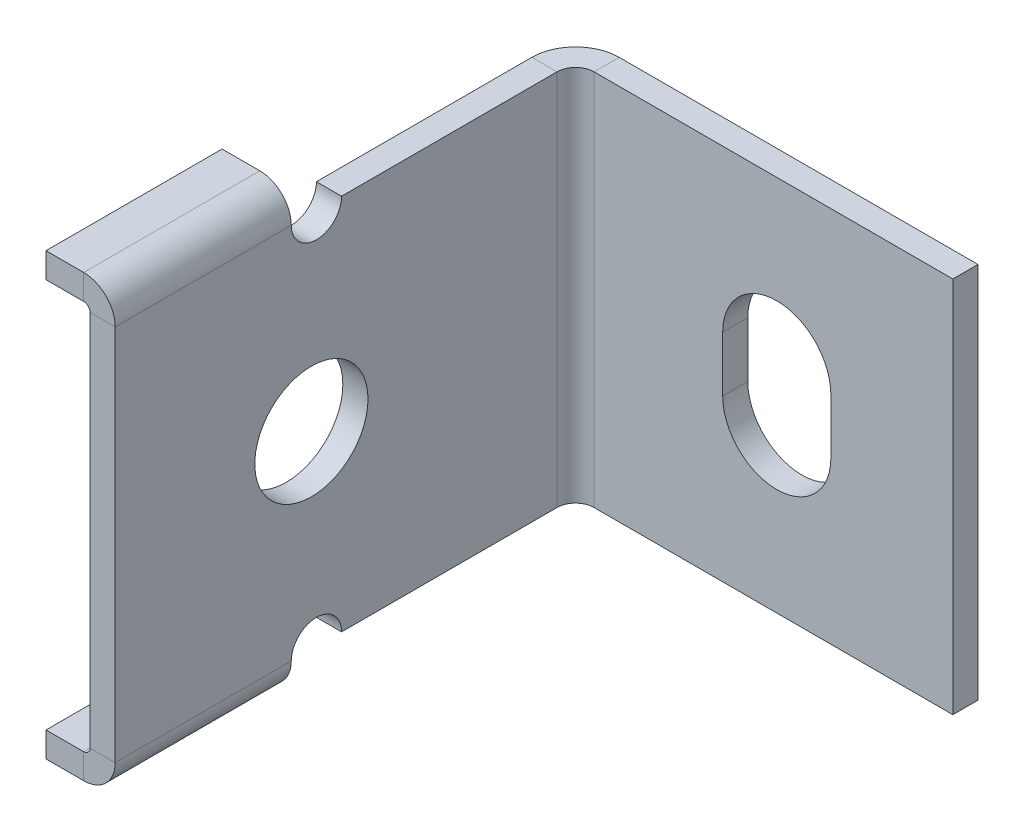
ISO-10303-21;
HEADER;
FILE_DESCRIPTION(('STEP AP214'),'2;1');
FILE_NAME('part.step','',(''),(''),'','','');
FILE_SCHEMA(('AUTOMOTIVE_DESIGN { 1 0 10303 214 1 1 1 1 }'));
ENDSEC;
DATA;
#1=APPLICATION_CONTEXT('core data for automotive mechanical design processes');
#2=APPLICATION_PROTOCOL_DEFINITION('international standard','automotive_design',2000,#1);
#3=PRODUCT_CONTEXT('',#1,'mechanical');
#4=PRODUCT('Part','Part','',(#3));
#5=PRODUCT_RELATED_PRODUCT_CATEGORY('part','',(#4));
#6=PRODUCT_DEFINITION_FORMATION('','',#4);
#7=PRODUCT_DEFINITION_CONTEXT('part definition',#1,'design');
#8=PRODUCT_DEFINITION('design','',#6,#7);
#9=PRODUCT_DEFINITION_SHAPE('','',#8);
#10=(LENGTH_UNIT() NAMED_UNIT(*) SI_UNIT(.MILLI.,.METRE.));
#11=(NAMED_UNIT(*) PLANE_ANGLE_UNIT() SI_UNIT($,.RADIAN.));
#12=(NAMED_UNIT(*) SI_UNIT($,.STERADIAN.) SOLID_ANGLE_UNIT());
#13=UNCERTAINTY_MEASURE_WITH_UNIT(LENGTH_MEASURE(1.E-05),#10,'distance_accuracy_value','');
#14=(GEOMETRIC_REPRESENTATION_CONTEXT(3) GLOBAL_UNCERTAINTY_ASSIGNED_CONTEXT((#13)) GLOBAL_UNIT_ASSIGNED_CONTEXT((#10,
#11,#12)) REPRESENTATION_CONTEXT('',''));
#15=CARTESIAN_POINT('',(0.,0.,0.));
#16=DIRECTION('',(0.,0.,1.));
#17=DIRECTION('',(1.,0.,0.));
#18=AXIS2_PLACEMENT_3D('',#15,#16,#17);
#19=CARTESIAN_POINT('',(1.7366,7.5,1.7366));
#20=DIRECTION('',(0.,-1.,0.));
#21=DIRECTION('',(1.,0.,0.));
#22=AXIS2_PLACEMENT_3D('',#19,#20,#21);
#23=PLANE('',#22);
#24=DIRECTION('',(-1.,0.,0.));
#25=VECTOR('',#24,1.);
#26=CARTESIAN_POINT('',(39.5603220616737,7.5,10.2999999999999));
#27=LINE('',#26,#25);
#28=CARTESIAN_POINT('',(1.00000000000001,7.5,10.3));
#29=VERTEX_POINT('',#28);
#30=CARTESIAN_POINT('',(0.,7.5,10.3));
#31=VERTEX_POINT('',#30);
#32=EDGE_CURVE('E387',#29,#31,#27,.T.);
#33=ORIENTED_EDGE('',*,*,#32,.F.);
#34=DIRECTION('',(0.,0.,-1.));
#35=VECTOR('',#34,1.);
#36=CARTESIAN_POINT('',(1.00000000000003,7.5,19.3));
#37=LINE('',#36,#35);
#38=CARTESIAN_POINT('',(1.,7.5,1.7366));
#39=VERTEX_POINT('',#38);
#40=EDGE_CURVE('E476',#29,#39,#37,.T.);
#41=ORIENTED_EDGE('',*,*,#40,.T.);
#42=DIRECTION('',(-1.,0.,0.));
#43=VECTOR('',#42,1.);
#44=CARTESIAN_POINT('',(1.,7.5,1.7366));
#45=LINE('',#44,#43);
#46=CARTESIAN_POINT('',(0.,7.5,1.7366));
#47=VERTEX_POINT('',#46);
#48=EDGE_CURVE('E532',#39,#47,#45,.T.);
#49=ORIENTED_EDGE('',*,*,#48,.T.);
#50=DIRECTION('',(0.,0.,-1.));
#51=VECTOR('',#50,1.);
#52=CARTESIAN_POINT('',(0.,7.5,19.3));
#53=LINE('',#52,#51);
#54=EDGE_CURVE('E469',#31,#47,#53,.T.);
#55=ORIENTED_EDGE('',*,*,#54,.F.);
#56=EDGE_LOOP('',(#33,#41,#49,#55));
#57=FACE_BOUND('',#56,.T.);
#58=ADVANCED_FACE('F157',(#57),#23,.F.);
#59=CARTESIAN_POINT('',(1.7366,-7.5,1.));
#60=DIRECTION('',(0.,-1.,0.));
#61=DIRECTION('',(0.,0.,-1.));
#62=AXIS2_PLACEMENT_3D('',#59,#60,#61);
#63=PLANE('',#62);
#64=DIRECTION('',(0.,0.,-1.));
#65=VECTOR('',#64,1.);
#66=CARTESIAN_POINT('',(1.00000000000003,-7.5,19.3));
#67=LINE('',#66,#65);
#68=CARTESIAN_POINT('',(1.00000000000001,-7.5,10.3));
#69=VERTEX_POINT('',#68);
#70=CARTESIAN_POINT('',(1.,-7.5,1.7366));
#71=VERTEX_POINT('',#70);
#72=EDGE_CURVE('E500',#69,#71,#67,.T.);
#73=ORIENTED_EDGE('',*,*,#72,.F.);
#74=DIRECTION('',(-1.,0.,0.));
#75=VECTOR('',#74,1.);
#76=CARTESIAN_POINT('',(38.4389389611191,-7.5,10.2999999999999));
#77=LINE('',#76,#75);
#78=CARTESIAN_POINT('',(0.,-7.5,10.3));
#79=VERTEX_POINT('',#78);
#80=EDGE_CURVE('E438',#69,#79,#77,.T.);
#81=ORIENTED_EDGE('',*,*,#80,.T.);
#82=DIRECTION('',(0.,0.,-1.));
#83=VECTOR('',#82,1.);
#84=CARTESIAN_POINT('',(0.,-7.5,19.3));
#85=LINE('',#84,#83);
#86=CARTESIAN_POINT('',(0.,-7.5,1.7366));
#87=VERTEX_POINT('',#86);
#88=EDGE_CURVE('E495',#79,#87,#85,.T.);
#89=ORIENTED_EDGE('',*,*,#88,.T.);
#90=DIRECTION('',(1.,0.,0.));
#91=VECTOR('',#90,1.);
#92=CARTESIAN_POINT('',(0.,-7.5,1.7366));
#93=LINE('',#92,#91);
#94=EDGE_CURVE('E529',#87,#71,#93,.T.);
#95=ORIENTED_EDGE('',*,*,#94,.T.);
#96=EDGE_LOOP('',(#73,#81,#89,#95));
#97=FACE_BOUND('',#96,.T.);
#98=ADVANCED_FACE('F548',(#97),#63,.T.);
#99=CARTESIAN_POINT('',(1.7366,7.5,0.));
#100=DIRECTION('',(0.,1.,0.));
#101=DIRECTION('',(0.,0.,1.));
#102=AXIS2_PLACEMENT_3D('',#99,#100,#101);
#103=PLANE('',#102);
#104=DIRECTION('',(0.,0.,1.));
#105=VECTOR('',#104,1.);
#106=CARTESIAN_POINT('',(1.7366,7.5,0.));
#107=LINE('',#106,#105);
#108=CARTESIAN_POINT('',(1.7366,7.5,0.));
#109=VERTEX_POINT('',#108);
#110=CARTESIAN_POINT('',(1.7366,7.5,1.));
#111=VERTEX_POINT('',#110);
#112=EDGE_CURVE('E535',#109,#111,#107,.T.);
#113=ORIENTED_EDGE('',*,*,#112,.F.);
#114=CARTESIAN_POINT('',(1.7366,7.5,1.7366));
#115=DIRECTION('',(0.,-1.,0.));
#116=DIRECTION('',(0.,0.,-1.));
#117=AXIS2_PLACEMENT_3D('',#114,#115,#116);
#118=CIRCLE('',#117,1.7366);
#119=EDGE_CURVE('E466',#47,#109,#118,.T.);
#120=ORIENTED_EDGE('',*,*,#119,.F.);
#121=ORIENTED_EDGE('',*,*,#48,.F.);
#122=CARTESIAN_POINT('',(1.7366,7.5,1.7366));
#123=DIRECTION('',(0.,1.,0.));
#124=DIRECTION('',(-1.,0.,0.));
#125=AXIS2_PLACEMENT_3D('',#122,#123,#124);
#126=CIRCLE('',#125,0.7366);
#127=EDGE_CURVE('E480',#39,#111,#126,.F.);
#128=ORIENTED_EDGE('',*,*,#127,.T.);
#129=EDGE_LOOP('',(#113,#120,#121,#128));
#130=FACE_BOUND('',#129,.T.);
#131=ADVANCED_FACE('F159',(#130),#103,.T.);
#132=CARTESIAN_POINT('',(1.,7.5,1.7366));
#133=DIRECTION('',(0.,1.,0.));
#134=DIRECTION('',(0.,0.,1.));
#135=AXIS2_PLACEMENT_3D('',#132,#133,#134);
#136=PLANE('',#135);
#137=DIRECTION('',(1.,0.,0.));
#138=VECTOR('',#137,1.);
#139=CARTESIAN_POINT('',(16.,7.5,0.));
#140=LINE('',#139,#138);
#141=CARTESIAN_POINT('',(16.,7.5,0.));
#142=VERTEX_POINT('',#141);
#143=EDGE_CURVE('E462',#109,#142,#140,.T.);
#144=ORIENTED_EDGE('',*,*,#143,.F.);
#145=ORIENTED_EDGE('',*,*,#112,.T.);
#146=DIRECTION('',(-1.,0.,0.));
#147=VECTOR('',#146,1.);
#148=CARTESIAN_POINT('',(16.,7.5,1.));
#149=LINE('',#148,#147);
#150=CARTESIAN_POINT('',(16.,7.5,1.));
#151=VERTEX_POINT('',#150);
#152=EDGE_CURVE('E455',#111,#151,#149,.F.);
#153=ORIENTED_EDGE('',*,*,#152,.T.);
#154=DIRECTION('',(0.,0.,1.));
#155=VECTOR('',#154,1.);
#156=CARTESIAN_POINT('',(16.,7.5,0.));
#157=LINE('',#156,#155);
#158=EDGE_CURVE('E458',#142,#151,#157,.T.);
#159=ORIENTED_EDGE('',*,*,#158,.F.);
#160=EDGE_LOOP('',(#144,#145,#153,#159));
#161=FACE_BOUND('',#160,.T.);
#162=ADVANCED_FACE('F578',(#161),#136,.T.);
#163=CARTESIAN_POINT('',(0.,-7.5,1.7366));
#164=DIRECTION('',(0.,-1.,0.));
#165=DIRECTION('',(0.,0.,-1.));
#166=AXIS2_PLACEMENT_3D('',#163,#164,#165);
#167=PLANE('',#166);
#168=ORIENTED_EDGE('',*,*,#94,.F.);
#169=CARTESIAN_POINT('',(1.7366,-7.5,1.7366));
#170=DIRECTION('',(0.,-1.,0.));
#171=DIRECTION('',(0.,0.,-1.));
#172=AXIS2_PLACEMENT_3D('',#169,#170,#171);
#173=CIRCLE('',#172,1.7366);
#174=CARTESIAN_POINT('',(1.7366,-7.5,0.));
#175=VERTEX_POINT('',#174);
#176=EDGE_CURVE('E492',#87,#175,#173,.T.);
#177=ORIENTED_EDGE('',*,*,#176,.T.);
#178=DIRECTION('',(0.,0.,-1.));
#179=VECTOR('',#178,1.);
#180=CARTESIAN_POINT('',(1.7366,-7.5,1.));
#181=LINE('',#180,#179);
#182=CARTESIAN_POINT('',(1.7366,-7.5,1.));
#183=VERTEX_POINT('',#182);
#184=EDGE_CURVE('E527',#183,#175,#181,.T.);
#185=ORIENTED_EDGE('',*,*,#184,.F.);
#186=CARTESIAN_POINT('',(1.7366,-7.5,1.7366));
#187=DIRECTION('',(0.,1.,0.));
#188=DIRECTION('',(-1.,0.,0.));
#189=AXIS2_PLACEMENT_3D('',#186,#187,#188);
#190=CIRCLE('',#189,0.7366);
#191=EDGE_CURVE('E459',#71,#183,#190,.F.);
#192=ORIENTED_EDGE('',*,*,#191,.F.);
#193=EDGE_LOOP('',(#168,#177,#185,#192));
#194=FACE_BOUND('',#193,.T.);
#195=ADVANCED_FACE('F557',(#194),#167,.T.);
#196=CARTESIAN_POINT('',(16.,7.5,1.));
#197=DIRECTION('',(0.,0.,-1.));
#198=DIRECTION('',(-1.,0.,0.));
#199=AXIS2_PLACEMENT_3D('',#196,#197,#198);
#200=PLANE('',#199);
#201=CARTESIAN_POINT('',(9.,1.1,1.));
#202=DIRECTION('',(0.,0.,1.));
#203=DIRECTION('',(1.,0.,0.));
#204=AXIS2_PLACEMENT_3D('',#201,#202,#203);
#205=CIRCLE('',#204,2.15);
#206=CARTESIAN_POINT('',(11.15,1.1,1.));
#207=VERTEX_POINT('',#206);
#208=CARTESIAN_POINT('',(6.85,1.1,1.));
#209=VERTEX_POINT('',#208);
#210=EDGE_CURVE('E330',#207,#209,#205,.T.);
#211=ORIENTED_EDGE('',*,*,#210,.F.);
#212=DIRECTION('',(0.,1.,0.));
#213=VECTOR('',#212,1.);
#214=CARTESIAN_POINT('',(11.15,-1.1,1.));
#215=LINE('',#214,#213);
#216=CARTESIAN_POINT('',(11.15,-1.1,1.));
#217=VERTEX_POINT('',#216);
#218=EDGE_CURVE('E969',#217,#207,#215,.T.);
#219=ORIENTED_EDGE('',*,*,#218,.F.);
#220=CARTESIAN_POINT('',(9.,-1.1,1.));
#221=DIRECTION('',(0.,0.,1.));
#222=DIRECTION('',(1.,0.,0.));
#223=AXIS2_PLACEMENT_3D('',#220,#221,#222);
#224=CIRCLE('',#223,2.15);
#225=CARTESIAN_POINT('',(6.85000000000001,-1.1,1.));
#226=VERTEX_POINT('',#225);
#227=EDGE_CURVE('E339',#226,#217,#224,.T.);
#228=ORIENTED_EDGE('',*,*,#227,.F.);
#229=DIRECTION('',(0.,1.,0.));
#230=VECTOR('',#229,1.);
#231=CARTESIAN_POINT('',(6.85,-1.1,1.));
#232=LINE('',#231,#230);
#233=EDGE_CURVE('E319',#226,#209,#232,.T.);
#234=ORIENTED_EDGE('',*,*,#233,.T.);
#235=EDGE_LOOP('',(#211,#219,#228,#234));
#236=FACE_BOUND('',#235,.T.);
#237=DIRECTION('',(-1.,0.,0.));
#238=VECTOR('',#237,1.);
#239=CARTESIAN_POINT('',(16.,-7.5,1.));
#240=LINE('',#239,#238);
#241=CARTESIAN_POINT('',(16.,-7.5,1.));
#242=VERTEX_POINT('',#241);
#243=EDGE_CURVE('E454',#183,#242,#240,.F.);
#244=ORIENTED_EDGE('',*,*,#243,.T.);
#245=DIRECTION('',(0.,-1.,0.));
#246=VECTOR('',#245,1.);
#247=CARTESIAN_POINT('',(16.,7.5,1.));
#248=LINE('',#247,#246);
#249=EDGE_CURVE('E525',#151,#242,#248,.T.);
#250=ORIENTED_EDGE('',*,*,#249,.F.);
#251=ORIENTED_EDGE('',*,*,#152,.F.);
#252=DIRECTION('',(0.,-1.,0.));
#253=VECTOR('',#252,1.);
#254=CARTESIAN_POINT('',(1.7366,7.5,1.));
#255=LINE('',#254,#253);
#256=EDGE_CURVE('E483',#111,#183,#255,.T.);
#257=ORIENTED_EDGE('',*,*,#256,.T.);
#258=EDGE_LOOP('',(#244,#250,#251,#257));
#259=FACE_BOUND('',#258,.T.);
#260=ADVANCED_FACE('F337',(#236,#259),#200,.F.);
#261=CARTESIAN_POINT('',(16.,7.5,0.));
#262=DIRECTION('',(1.,0.,0.));
#263=DIRECTION('',(0.,0.,-1.));
#264=AXIS2_PLACEMENT_3D('',#261,#262,#263);
#265=PLANE('',#264);
#266=DIRECTION('',(0.,0.,1.));
#267=VECTOR('',#266,1.);
#268=CARTESIAN_POINT('',(16.,-7.5,0.));
#269=LINE('',#268,#267);
#270=CARTESIAN_POINT('',(16.,-7.5,0.));
#271=VERTEX_POINT('',#270);
#272=EDGE_CURVE('E486',#271,#242,#269,.T.);
#273=ORIENTED_EDGE('',*,*,#272,.F.);
#274=DIRECTION('',(0.,-1.,0.));
#275=VECTOR('',#274,1.);
#276=CARTESIAN_POINT('',(16.,7.5,0.));
#277=LINE('',#276,#275);
#278=EDGE_CURVE('E523',#142,#271,#277,.T.);
#279=ORIENTED_EDGE('',*,*,#278,.F.);
#280=ORIENTED_EDGE('',*,*,#158,.T.);
#281=ORIENTED_EDGE('',*,*,#249,.T.);
#282=EDGE_LOOP('',(#273,#279,#280,#281));
#283=FACE_BOUND('',#282,.T.);
#284=ADVANCED_FACE('F574',(#283),#265,.T.);
#285=CARTESIAN_POINT('',(16.,7.5,0.));
#286=DIRECTION('',(0.,0.,-1.));
#287=DIRECTION('',(-1.,0.,0.));
#288=AXIS2_PLACEMENT_3D('',#285,#286,#287);
#289=PLANE('',#288);
#290=CARTESIAN_POINT('',(9.,1.1,0.));
#291=DIRECTION('',(0.,0.,1.));
#292=DIRECTION('',(1.,0.,0.));
#293=AXIS2_PLACEMENT_3D('',#290,#291,#292);
#294=CIRCLE('',#293,2.15);
#295=CARTESIAN_POINT('',(11.15,1.1,0.));
#296=VERTEX_POINT('',#295);
#297=CARTESIAN_POINT('',(6.85,1.1,0.));
#298=VERTEX_POINT('',#297);
#299=EDGE_CURVE('E326',#296,#298,#294,.T.);
#300=ORIENTED_EDGE('',*,*,#299,.T.);
#301=DIRECTION('',(0.,1.,0.));
#302=VECTOR('',#301,1.);
#303=CARTESIAN_POINT('',(6.85,-1.1,0.));
#304=LINE('',#303,#302);
#305=CARTESIAN_POINT('',(6.85,-1.1,0.));
#306=VERTEX_POINT('',#305);
#307=EDGE_CURVE('E322',#306,#298,#304,.T.);
#308=ORIENTED_EDGE('',*,*,#307,.F.);
#309=CARTESIAN_POINT('',(9.,-1.1,0.));
#310=DIRECTION('',(0.,0.,1.));
#311=DIRECTION('',(1.,0.,0.));
#312=AXIS2_PLACEMENT_3D('',#309,#310,#311);
#313=CIRCLE('',#312,2.15);
#314=CARTESIAN_POINT('',(11.15,-1.1,0.));
#315=VERTEX_POINT('',#314);
#316=EDGE_CURVE('E347',#306,#315,#313,.T.);
#317=ORIENTED_EDGE('',*,*,#316,.T.);
#318=DIRECTION('',(0.,1.,0.));
#319=VECTOR('',#318,1.);
#320=CARTESIAN_POINT('',(11.15,-1.1,0.));
#321=LINE('',#320,#319);
#322=EDGE_CURVE('E342',#315,#296,#321,.T.);
#323=ORIENTED_EDGE('',*,*,#322,.T.);
#324=EDGE_LOOP('',(#300,#308,#317,#323));
#325=FACE_BOUND('',#324,.T.);
#326=DIRECTION('',(1.,0.,0.));
#327=VECTOR('',#326,1.);
#328=CARTESIAN_POINT('',(16.,-7.5,0.));
#329=LINE('',#328,#327);
#330=EDGE_CURVE('E489',#175,#271,#329,.T.);
#331=ORIENTED_EDGE('',*,*,#330,.F.);
#332=DIRECTION('',(0.,-1.,0.));
#333=VECTOR('',#332,1.);
#334=CARTESIAN_POINT('',(1.7366,7.5,0.));
#335=LINE('',#334,#333);
#336=EDGE_CURVE('E520',#109,#175,#335,.T.);
#337=ORIENTED_EDGE('',*,*,#336,.F.);
#338=ORIENTED_EDGE('',*,*,#143,.T.);
#339=ORIENTED_EDGE('',*,*,#278,.T.);
#340=EDGE_LOOP('',(#331,#337,#338,#339));
#341=FACE_BOUND('',#340,.T.);
#342=ADVANCED_FACE('F570',(#325,#341),#289,.T.);
#343=CARTESIAN_POINT('',(1.7366,7.5,1.7366));
#344=DIRECTION('',(0.,-1.,0.));
#345=DIRECTION('',(0.,0.,-1.));
#346=AXIS2_PLACEMENT_3D('',#343,#344,#345);
#347=CYLINDRICAL_SURFACE('',#346,1.7366);
#348=ORIENTED_EDGE('',*,*,#176,.F.);
#349=DIRECTION('',(0.,-1.,0.));
#350=VECTOR('',#349,1.);
#351=CARTESIAN_POINT('',(0.,7.5,1.7366));
#352=LINE('',#351,#350);
#353=EDGE_CURVE('E517',#47,#87,#352,.T.);
#354=ORIENTED_EDGE('',*,*,#353,.F.);
#355=ORIENTED_EDGE('',*,*,#119,.T.);
#356=ORIENTED_EDGE('',*,*,#336,.T.);
#357=EDGE_LOOP('',(#348,#354,#355,#356));
#358=FACE_BOUND('',#357,.T.);
#359=ADVANCED_FACE('F565',(#358),#347,.T.);
#360=CARTESIAN_POINT('',(0.,7.5,19.3));
#361=DIRECTION('',(-1.,0.,0.));
#362=DIRECTION('',(0.,0.,1.));
#363=AXIS2_PLACEMENT_3D('',#360,#361,#362);
#364=PLANE('',#363);
#365=CARTESIAN_POINT('',(0.,0.,11.5));
#366=DIRECTION('',(-1.,0.,0.));
#367=DIRECTION('',(0.,0.,1.));
#368=AXIS2_PLACEMENT_3D('',#365,#366,#367);
#369=CIRCLE('',#368,2.25);
#370=CARTESIAN_POINT('',(0.,0.,13.75));
#371=VERTEX_POINT('',#370);
#372=EDGE_CURVE('E964',#371,#371,#369,.T.);
#373=ORIENTED_EDGE('',*,*,#372,.F.);
#374=EDGE_LOOP('',(#373));
#375=FACE_BOUND('',#374,.T.);
#376=CARTESIAN_POINT('',(0.,7.5,11.3));
#377=DIRECTION('',(-1.,0.,0.));
#378=DIRECTION('',(0.,0.,1.));
#379=AXIS2_PLACEMENT_3D('',#376,#377,#378);
#380=CIRCLE('',#379,1.);
#381=CARTESIAN_POINT('',(0.,7.5,12.3));
#382=VERTEX_POINT('',#381);
#383=EDGE_CURVE('E399',#31,#382,#380,.T.);
#384=ORIENTED_EDGE('',*,*,#383,.F.);
#385=ORIENTED_EDGE('',*,*,#54,.T.);
#386=ORIENTED_EDGE('',*,*,#353,.T.);
#387=ORIENTED_EDGE('',*,*,#88,.F.);
#388=CARTESIAN_POINT('',(0.,-7.5,11.3));
#389=DIRECTION('',(-1.,0.,0.));
#390=DIRECTION('',(0.,0.,1.));
#391=AXIS2_PLACEMENT_3D('',#388,#389,#390);
#392=CIRCLE('',#391,1.);
#393=CARTESIAN_POINT('',(0.,-7.5,12.3));
#394=VERTEX_POINT('',#393);
#395=EDGE_CURVE('E450',#79,#394,#392,.F.);
#396=ORIENTED_EDGE('',*,*,#395,.T.);
#397=CARTESIAN_POINT('',(0.,-7.5,19.3));
#398=VERTEX_POINT('',#397);
#399=EDGE_CURVE('E496',#398,#394,#85,.T.);
#400=ORIENTED_EDGE('',*,*,#399,.F.);
#401=DIRECTION('',(0.,-1.,0.));
#402=VECTOR('',#401,1.);
#403=CARTESIAN_POINT('',(0.,7.5,19.3));
#404=LINE('',#403,#402);
#405=CARTESIAN_POINT('',(0.,7.5,19.3));
#406=VERTEX_POINT('',#405);
#407=EDGE_CURVE('E514',#406,#398,#404,.T.);
#408=ORIENTED_EDGE('',*,*,#407,.F.);
#409=EDGE_CURVE('E470',#406,#382,#53,.T.);
#410=ORIENTED_EDGE('',*,*,#409,.T.);
#411=EDGE_LOOP('',(#384,#385,#386,#387,#396,#400,#408,#410));
#412=FACE_BOUND('',#411,.T.);
#413=ADVANCED_FACE('F586',(#375,#412),#364,.T.);
#414=CARTESIAN_POINT('',(1.00000000000003,7.5,19.3));
#415=DIRECTION('',(0.,0.,1.));
#416=DIRECTION('',(1.,0.,0.));
#417=AXIS2_PLACEMENT_3D('',#414,#415,#416);
#418=PLANE('',#417);
#419=DIRECTION('',(-1.,0.,0.));
#420=VECTOR('',#419,1.);
#421=CARTESIAN_POINT('',(1.00000000000003,-7.5,19.3));
#422=LINE('',#421,#420);
#423=CARTESIAN_POINT('',(1.00000000000003,-7.5,19.3));
#424=VERTEX_POINT('',#423);
#425=EDGE_CURVE('E498',#424,#398,#422,.T.);
#426=ORIENTED_EDGE('',*,*,#425,.F.);
#427=DIRECTION('',(0.,-1.,0.));
#428=VECTOR('',#427,1.);
#429=CARTESIAN_POINT('',(1.00000000000003,7.5,19.3));
#430=LINE('',#429,#428);
#431=CARTESIAN_POINT('',(1.00000000000003,7.5,19.3));
#432=VERTEX_POINT('',#431);
#433=EDGE_CURVE('E511',#432,#424,#430,.T.);
#434=ORIENTED_EDGE('',*,*,#433,.F.);
#435=DIRECTION('',(-1.,0.,0.));
#436=VECTOR('',#435,1.);
#437=CARTESIAN_POINT('',(1.00000000000003,7.5,19.3));
#438=LINE('',#437,#436);
#439=EDGE_CURVE('E473',#432,#406,#438,.T.);
#440=ORIENTED_EDGE('',*,*,#439,.T.);
#441=ORIENTED_EDGE('',*,*,#407,.T.);
#442=EDGE_LOOP('',(#426,#434,#440,#441));
#443=FACE_BOUND('',#442,.T.);
#444=ADVANCED_FACE('F648',(#443),#418,.T.);
#445=CARTESIAN_POINT('',(1.00000000000003,7.5,19.3));
#446=DIRECTION('',(-1.,0.,0.));
#447=DIRECTION('',(0.,0.,1.));
#448=AXIS2_PLACEMENT_3D('',#445,#446,#447);
#449=PLANE('',#448);
#450=CARTESIAN_POINT('',(1.00000000000002,0.,11.5));
#451=DIRECTION('',(1.,0.,0.));
#452=DIRECTION('',(0.,0.,-1.));
#453=AXIS2_PLACEMENT_3D('',#450,#451,#452);
#454=CIRCLE('',#453,2.25);
#455=CARTESIAN_POINT('',(1.00000000000001,0.,9.25));
#456=VERTEX_POINT('',#455);
#457=EDGE_CURVE('E967',#456,#456,#454,.T.);
#458=ORIENTED_EDGE('',*,*,#457,.F.);
#459=EDGE_LOOP('',(#458));
#460=FACE_BOUND('',#459,.T.);
#461=ORIENTED_EDGE('',*,*,#40,.F.);
#462=CARTESIAN_POINT('',(1.00000000000001,7.5,11.3));
#463=DIRECTION('',(-1.,0.,0.));
#464=DIRECTION('',(0.,0.,1.));
#465=AXIS2_PLACEMENT_3D('',#462,#463,#464);
#466=CIRCLE('',#465,1.);
#467=CARTESIAN_POINT('',(1.00000000000001,7.5,12.3));
#468=VERTEX_POINT('',#467);
#469=EDGE_CURVE('E14',#29,#468,#466,.T.);
#470=ORIENTED_EDGE('',*,*,#469,.T.);
#471=EDGE_CURVE('E477',#432,#468,#37,.T.);
#472=ORIENTED_EDGE('',*,*,#471,.F.);
#473=ORIENTED_EDGE('',*,*,#433,.T.);
#474=CARTESIAN_POINT('',(1.00000000000001,-7.5,12.3));
#475=VERTEX_POINT('',#474);
#476=EDGE_CURVE('E501',#424,#475,#67,.T.);
#477=ORIENTED_EDGE('',*,*,#476,.T.);
#478=CARTESIAN_POINT('',(1.00000000000001,-7.5,11.3));
#479=DIRECTION('',(-1.,0.,0.));
#480=DIRECTION('',(0.,0.,1.));
#481=AXIS2_PLACEMENT_3D('',#478,#479,#480);
#482=CIRCLE('',#481,1.);
#483=EDGE_CURVE('E165',#69,#475,#482,.F.);
#484=ORIENTED_EDGE('',*,*,#483,.F.);
#485=ORIENTED_EDGE('',*,*,#72,.T.);
#486=DIRECTION('',(0.,-1.,0.));
#487=VECTOR('',#486,1.);
#488=CARTESIAN_POINT('',(1.,7.5,1.7366));
#489=LINE('',#488,#487);
#490=EDGE_CURVE('E508',#39,#71,#489,.T.);
#491=ORIENTED_EDGE('',*,*,#490,.F.);
#492=EDGE_LOOP('',(#461,#470,#472,#473,#477,#484,#485,#491));
#493=FACE_BOUND('',#492,.T.);
#494=ADVANCED_FACE('F545',(#460,#493),#449,.F.);
#495=CARTESIAN_POINT('',(1.7366,7.5,1.7366));
#496=DIRECTION('',(0.,-1.,0.));
#497=DIRECTION('',(0.,0.,-1.));
#498=AXIS2_PLACEMENT_3D('',#495,#496,#497);
#499=CYLINDRICAL_SURFACE('',#498,0.7366);
#500=ORIENTED_EDGE('',*,*,#191,.T.);
#501=ORIENTED_EDGE('',*,*,#256,.F.);
#502=ORIENTED_EDGE('',*,*,#127,.F.);
#503=ORIENTED_EDGE('',*,*,#490,.T.);
#504=EDGE_LOOP('',(#500,#501,#502,#503));
#505=FACE_BOUND('',#504,.T.);
#506=ADVANCED_FACE('F555',(#505),#499,.F.);
#507=CARTESIAN_POINT('',(1.7366,-7.5,1.7366));
#508=DIRECTION('',(0.,-1.,0.));
#509=DIRECTION('',(1.,0.,0.));
#510=AXIS2_PLACEMENT_3D('',#507,#508,#509);
#511=PLANE('',#510);
#512=ORIENTED_EDGE('',*,*,#243,.F.);
#513=ORIENTED_EDGE('',*,*,#184,.T.);
#514=ORIENTED_EDGE('',*,*,#330,.T.);
#515=ORIENTED_EDGE('',*,*,#272,.T.);
#516=EDGE_LOOP('',(#512,#513,#514,#515));
#517=FACE_BOUND('',#516,.T.);
#518=ADVANCED_FACE('F561',(#517),#511,.T.);
#519=CARTESIAN_POINT('',(38.4389389611191,-7.5,11.2999999999999));
#520=DIRECTION('',(-1.,0.,0.));
#521=DIRECTION('',(0.,0.,1.));
#522=AXIS2_PLACEMENT_3D('',#519,#520,#521);
#523=CYLINDRICAL_SURFACE('',#522,1.);
#524=ORIENTED_EDGE('',*,*,#395,.F.);
#525=ORIENTED_EDGE('',*,*,#80,.F.);
#526=ORIENTED_EDGE('',*,*,#483,.T.);
#527=DIRECTION('',(-1.,0.,0.));
#528=VECTOR('',#527,1.);
#529=CARTESIAN_POINT('',(38.4389389611191,-7.5,12.2999999999999));
#530=LINE('',#529,#528);
#531=EDGE_CURVE('E447',#475,#394,#530,.T.);
#532=ORIENTED_EDGE('',*,*,#531,.T.);
#533=EDGE_LOOP('',(#524,#525,#526,#532));
#534=FACE_BOUND('',#533,.T.);
#535=ADVANCED_FACE('F540',(#534),#523,.F.);
#536=CARTESIAN_POINT('',(-0.249999999999985,-7.5,12.3));
#537=DIRECTION('',(0.,0.,-1.));
#538=DIRECTION('',(-1.,0.,0.));
#539=AXIS2_PLACEMENT_3D('',#536,#537,#538);
#540=PLANE('',#539);
#541=DIRECTION('',(0.,-1.,0.));
#542=VECTOR('',#541,1.);
#543=CARTESIAN_POINT('',(-0.24999999999998,-8.75,12.3));
#544=LINE('',#543,#542);
#545=CARTESIAN_POINT('',(-0.249999999999984,-7.75,12.3));
#546=VERTEX_POINT('',#545);
#547=CARTESIAN_POINT('',(-0.249999999999981,-8.75,12.3));
#548=VERTEX_POINT('',#547);
#549=EDGE_CURVE('E402',#546,#548,#544,.T.);
#550=ORIENTED_EDGE('',*,*,#549,.F.);
#551=CARTESIAN_POINT('',(-0.249999999999985,-7.5,12.3));
#552=DIRECTION('',(0.,0.,1.));
#553=DIRECTION('',(1.,0.,0.));
#554=AXIS2_PLACEMENT_3D('',#551,#552,#553);
#555=CIRCLE('',#554,0.25);
#556=EDGE_CURVE('E442',#394,#546,#555,.F.);
#557=ORIENTED_EDGE('',*,*,#556,.F.);
#558=ORIENTED_EDGE('',*,*,#531,.F.);
#559=CARTESIAN_POINT('',(-0.249999999999985,-7.5,12.3));
#560=DIRECTION('',(0.,0.,1.));
#561=DIRECTION('',(1.,0.,0.));
#562=AXIS2_PLACEMENT_3D('',#559,#560,#561);
#563=CIRCLE('',#562,1.25);
#564=EDGE_CURVE('E435',#475,#548,#563,.F.);
#565=ORIENTED_EDGE('',*,*,#564,.T.);
#566=EDGE_LOOP('',(#550,#557,#558,#565));
#567=FACE_BOUND('',#566,.T.);
#568=ADVANCED_FACE('F689',(#567),#540,.T.);
#569=CARTESIAN_POINT('',(-0.249999999999971,-7.5,19.3));
#570=DIRECTION('',(0.,0.,-1.));
#571=DIRECTION('',(-1.,0.,0.));
#572=AXIS2_PLACEMENT_3D('',#569,#570,#571);
#573=PLANE('',#572);
#574=CARTESIAN_POINT('',(-0.249999999999971,-7.5,19.3));
#575=DIRECTION('',(0.,0.,1.));
#576=DIRECTION('',(1.,0.,0.));
#577=AXIS2_PLACEMENT_3D('',#574,#575,#576);
#578=CIRCLE('',#577,0.25);
#579=CARTESIAN_POINT('',(-0.24999999999997,-7.75,19.3));
#580=VERTEX_POINT('',#579);
#581=EDGE_CURVE('E405',#580,#398,#578,.T.);
#582=ORIENTED_EDGE('',*,*,#581,.F.);
#583=DIRECTION('',(0.,-1.,0.));
#584=VECTOR('',#583,1.);
#585=CARTESIAN_POINT('',(-0.249999999999971,-7.75,19.3));
#586=LINE('',#585,#584);
#587=CARTESIAN_POINT('',(-0.249999999999967,-8.75,19.3));
#588=VERTEX_POINT('',#587);
#589=EDGE_CURVE('E428',#580,#588,#586,.T.);
#590=ORIENTED_EDGE('',*,*,#589,.T.);
#591=CARTESIAN_POINT('',(-0.249999999999971,-7.5,19.3));
#592=DIRECTION('',(0.,0.,1.));
#593=DIRECTION('',(1.,0.,0.));
#594=AXIS2_PLACEMENT_3D('',#591,#592,#593);
#595=CIRCLE('',#594,1.25);
#596=EDGE_CURVE('E439',#588,#424,#595,.T.);
#597=ORIENTED_EDGE('',*,*,#596,.T.);
#598=ORIENTED_EDGE('',*,*,#425,.T.);
#599=EDGE_LOOP('',(#582,#590,#597,#598));
#600=FACE_BOUND('',#599,.T.);
#601=ADVANCED_FACE('F698',(#600),#573,.F.);
#602=CARTESIAN_POINT('',(-0.249999999999971,-7.5,19.3));
#603=DIRECTION('',(0.,0.,1.));
#604=DIRECTION('',(0.,-1.,0.));
#605=AXIS2_PLACEMENT_3D('',#602,#603,#604);
#606=CYLINDRICAL_SURFACE('',#605,1.25);
#607=ORIENTED_EDGE('',*,*,#476,.F.);
#608=ORIENTED_EDGE('',*,*,#596,.F.);
#609=DIRECTION('',(0.,0.,1.));
#610=VECTOR('',#609,1.);
#611=CARTESIAN_POINT('',(-0.250000000000003,-8.75,0.));
#612=LINE('',#611,#610);
#613=EDGE_CURVE('E425',#548,#588,#612,.T.);
#614=ORIENTED_EDGE('',*,*,#613,.F.);
#615=ORIENTED_EDGE('',*,*,#564,.F.);
#616=EDGE_LOOP('',(#607,#608,#614,#615));
#617=FACE_BOUND('',#616,.T.);
#618=ADVANCED_FACE('F709',(#617),#606,.T.);
#619=CARTESIAN_POINT('',(-0.249999999999971,-7.5,19.3));
#620=DIRECTION('',(0.,0.,1.));
#621=DIRECTION('',(0.,-1.,0.));
#622=AXIS2_PLACEMENT_3D('',#619,#620,#621);
#623=CYLINDRICAL_SURFACE('',#622,0.25);
#624=ORIENTED_EDGE('',*,*,#399,.T.);
#625=ORIENTED_EDGE('',*,*,#556,.T.);
#626=DIRECTION('',(0.,0.,-1.));
#627=VECTOR('',#626,1.);
#628=CARTESIAN_POINT('',(-0.249999999999984,-7.75,12.3));
#629=LINE('',#628,#627);
#630=EDGE_CURVE('E431',#546,#580,#629,.F.);
#631=ORIENTED_EDGE('',*,*,#630,.T.);
#632=ORIENTED_EDGE('',*,*,#581,.T.);
#633=EDGE_LOOP('',(#624,#625,#631,#632));
#634=FACE_BOUND('',#633,.T.);
#635=ADVANCED_FACE('F719',(#634),#623,.F.);
#636=CARTESIAN_POINT('',(0.,-8.75,19.3));
#637=DIRECTION('',(0.,0.,1.));
#638=DIRECTION('',(1.,0.,0.));
#639=AXIS2_PLACEMENT_3D('',#636,#637,#638);
#640=PLANE('',#639);
#641=DIRECTION('',(1.,0.,0.));
#642=VECTOR('',#641,1.);
#643=CARTESIAN_POINT('',(0.,-8.75,19.3));
#644=LINE('',#643,#642);
#645=CARTESIAN_POINT('',(-1.74999999999997,-8.75,19.3));
#646=VERTEX_POINT('',#645);
#647=EDGE_CURVE('E409',#646,#588,#644,.T.);
#648=ORIENTED_EDGE('',*,*,#647,.T.);
#649=ORIENTED_EDGE('',*,*,#589,.F.);
#650=DIRECTION('',(-1.,0.,0.));
#651=VECTOR('',#650,1.);
#652=CARTESIAN_POINT('',(1.02546939194172E-13,-7.75,19.3));
#653=LINE('',#652,#651);
#654=CARTESIAN_POINT('',(-1.74999999999997,-7.75000000000001,19.3));
#655=VERTEX_POINT('',#654);
#656=EDGE_CURVE('E417',#655,#580,#653,.F.);
#657=ORIENTED_EDGE('',*,*,#656,.F.);
#658=DIRECTION('',(0.,1.,0.));
#659=VECTOR('',#658,1.);
#660=CARTESIAN_POINT('',(-1.74999999999997,-8.75,19.3));
#661=LINE('',#660,#659);
#662=EDGE_CURVE('E403',#646,#655,#661,.T.);
#663=ORIENTED_EDGE('',*,*,#662,.F.);
#664=EDGE_LOOP('',(#648,#649,#657,#663));
#665=FACE_BOUND('',#664,.T.);
#666=ADVANCED_FACE('F730',(#665),#640,.T.);
#667=CARTESIAN_POINT('',(-1.74999999999998,-8.75,12.3));
#668=DIRECTION('',(0.,0.,-1.));
#669=DIRECTION('',(-1.,0.,0.));
#670=AXIS2_PLACEMENT_3D('',#667,#668,#669);
#671=PLANE('',#670);
#672=DIRECTION('',(1.,0.,0.));
#673=VECTOR('',#672,1.);
#674=CARTESIAN_POINT('',(0.,-7.75,12.3));
#675=LINE('',#674,#673);
#676=CARTESIAN_POINT('',(-1.74999999999998,-7.75000000000001,12.3));
#677=VERTEX_POINT('',#676);
#678=EDGE_CURVE('E423',#546,#677,#675,.F.);
#679=ORIENTED_EDGE('',*,*,#678,.F.);
#680=ORIENTED_EDGE('',*,*,#549,.T.);
#681=DIRECTION('',(-1.,0.,0.));
#682=VECTOR('',#681,1.);
#683=CARTESIAN_POINT('',(-1.74999999999998,-8.75,12.3));
#684=LINE('',#683,#682);
#685=CARTESIAN_POINT('',(-1.74999999999998,-8.75,12.3));
#686=VERTEX_POINT('',#685);
#687=EDGE_CURVE('E415',#548,#686,#684,.T.);
#688=ORIENTED_EDGE('',*,*,#687,.T.);
#689=DIRECTION('',(0.,1.,0.));
#690=VECTOR('',#689,1.);
#691=CARTESIAN_POINT('',(-1.74999999999998,-8.75,12.3));
#692=LINE('',#691,#690);
#693=EDGE_CURVE('E406',#686,#677,#692,.T.);
#694=ORIENTED_EDGE('',*,*,#693,.T.);
#695=EDGE_LOOP('',(#679,#680,#688,#694));
#696=FACE_BOUND('',#695,.T.);
#697=ADVANCED_FACE('F741',(#696),#671,.T.);
#698=CARTESIAN_POINT('',(0.,-8.75,0.));
#699=DIRECTION('',(0.,-1.,0.));
#700=DIRECTION('',(1.,0.,0.));
#701=AXIS2_PLACEMENT_3D('',#698,#699,#700);
#702=PLANE('',#701);
#703=ORIENTED_EDGE('',*,*,#687,.F.);
#704=ORIENTED_EDGE('',*,*,#613,.T.);
#705=ORIENTED_EDGE('',*,*,#647,.F.);
#706=DIRECTION('',(0.,0.,1.));
#707=VECTOR('',#706,1.);
#708=CARTESIAN_POINT('',(-1.74999999999997,-8.75,19.3));
#709=LINE('',#708,#707);
#710=EDGE_CURVE('E412',#686,#646,#709,.T.);
#711=ORIENTED_EDGE('',*,*,#710,.F.);
#712=EDGE_LOOP('',(#703,#704,#705,#711));
#713=FACE_BOUND('',#712,.T.);
#714=ADVANCED_FACE('F752',(#713),#702,.T.);
#715=CARTESIAN_POINT('',(0.,-7.75,0.));
#716=DIRECTION('',(0.,-1.,0.));
#717=DIRECTION('',(1.,0.,0.));
#718=AXIS2_PLACEMENT_3D('',#715,#716,#717);
#719=PLANE('',#718);
#720=ORIENTED_EDGE('',*,*,#630,.F.);
#721=ORIENTED_EDGE('',*,*,#678,.T.);
#722=DIRECTION('',(0.,0.,-1.));
#723=VECTOR('',#722,1.);
#724=CARTESIAN_POINT('',(-1.75000000000001,-7.75000000000001,0.));
#725=LINE('',#724,#723);
#726=EDGE_CURVE('E420',#677,#655,#725,.F.);
#727=ORIENTED_EDGE('',*,*,#726,.T.);
#728=ORIENTED_EDGE('',*,*,#656,.T.);
#729=EDGE_LOOP('',(#720,#721,#727,#728));
#730=FACE_BOUND('',#729,.T.);
#731=ADVANCED_FACE('F763',(#730),#719,.F.);
#732=CARTESIAN_POINT('',(-1.74999999999997,-8.75,19.3));
#733=DIRECTION('',(-1.,0.,0.));
#734=DIRECTION('',(0.,-1.,0.));
#735=AXIS2_PLACEMENT_3D('',#732,#733,#734);
#736=PLANE('',#735);
#737=ORIENTED_EDGE('',*,*,#726,.F.);
#738=ORIENTED_EDGE('',*,*,#693,.F.);
#739=ORIENTED_EDGE('',*,*,#710,.T.);
#740=ORIENTED_EDGE('',*,*,#662,.T.);
#741=EDGE_LOOP('',(#737,#738,#739,#740));
#742=FACE_BOUND('',#741,.T.);
#743=ADVANCED_FACE('F774',(#742),#736,.T.);
#744=CARTESIAN_POINT('',(39.5603220616737,7.5,11.2999999999999));
#745=DIRECTION('',(-1.,0.,0.));
#746=DIRECTION('',(0.,0.,1.));
#747=AXIS2_PLACEMENT_3D('',#744,#745,#746);
#748=CYLINDRICAL_SURFACE('',#747,1.);
#749=ORIENTED_EDGE('',*,*,#32,.T.);
#750=ORIENTED_EDGE('',*,*,#383,.T.);
#751=DIRECTION('',(-1.,0.,0.));
#752=VECTOR('',#751,1.);
#753=CARTESIAN_POINT('',(39.5603220616737,7.5,12.2999999999999));
#754=LINE('',#753,#752);
#755=EDGE_CURVE('E396',#468,#382,#754,.T.);
#756=ORIENTED_EDGE('',*,*,#755,.F.);
#757=ORIENTED_EDGE('',*,*,#469,.F.);
#758=EDGE_LOOP('',(#749,#750,#756,#757));
#759=FACE_BOUND('',#758,.T.);
#760=ADVANCED_FACE('F590',(#759),#748,.F.);
#761=CARTESIAN_POINT('',(-0.249999999999972,7.5,19.3));
#762=DIRECTION('',(0.,0.,1.));
#763=DIRECTION('',(1.,0.,0.));
#764=AXIS2_PLACEMENT_3D('',#761,#762,#763);
#765=PLANE('',#764);
#766=DIRECTION('',(0.,-1.,0.));
#767=VECTOR('',#766,1.);
#768=CARTESIAN_POINT('',(-0.249999999999968,8.75,19.3));
#769=LINE('',#768,#767);
#770=CARTESIAN_POINT('',(-0.249999999999971,7.75,19.3));
#771=VERTEX_POINT('',#770);
#772=CARTESIAN_POINT('',(-0.249999999999968,8.75,19.3));
#773=VERTEX_POINT('',#772);
#774=EDGE_CURVE('E325',#771,#773,#769,.F.);
#775=ORIENTED_EDGE('',*,*,#774,.F.);
#776=CARTESIAN_POINT('',(-0.249999999999972,7.5,19.3));
#777=DIRECTION('',(0.,0.,-1.));
#778=DIRECTION('',(-1.,0.,0.));
#779=AXIS2_PLACEMENT_3D('',#776,#777,#778);
#780=CIRCLE('',#779,0.25);
#781=EDGE_CURVE('E391',#406,#771,#780,.F.);
#782=ORIENTED_EDGE('',*,*,#781,.F.);
#783=ORIENTED_EDGE('',*,*,#439,.F.);
#784=CARTESIAN_POINT('',(-0.249999999999972,7.5,19.3));
#785=DIRECTION('',(0.,0.,-1.));
#786=DIRECTION('',(-1.,0.,0.));
#787=AXIS2_PLACEMENT_3D('',#784,#785,#786);
#788=CIRCLE('',#787,1.25);
#789=EDGE_CURVE('E384',#432,#773,#788,.F.);
#790=ORIENTED_EDGE('',*,*,#789,.T.);
#791=EDGE_LOOP('',(#775,#782,#783,#790));
#792=FACE_BOUND('',#791,.T.);
#793=ADVANCED_FACE('F598',(#792),#765,.T.);
#794=CARTESIAN_POINT('',(-0.249999999999986,7.5,12.3));
#795=DIRECTION('',(0.,0.,1.));
#796=DIRECTION('',(1.,0.,0.));
#797=AXIS2_PLACEMENT_3D('',#794,#795,#796);
#798=PLANE('',#797);
#799=CARTESIAN_POINT('',(-0.249999999999986,7.5,12.3));
#800=DIRECTION('',(0.,0.,-1.));
#801=DIRECTION('',(-1.,0.,0.));
#802=AXIS2_PLACEMENT_3D('',#799,#800,#801);
#803=CIRCLE('',#802,0.25);
#804=CARTESIAN_POINT('',(-0.249999999999985,7.75,12.3));
#805=VERTEX_POINT('',#804);
#806=EDGE_CURVE('E356',#805,#382,#803,.T.);
#807=ORIENTED_EDGE('',*,*,#806,.F.);
#808=DIRECTION('',(0.,-1.,0.));
#809=VECTOR('',#808,1.);
#810=CARTESIAN_POINT('',(-0.249999999999985,7.75,12.3));
#811=LINE('',#810,#809);
#812=CARTESIAN_POINT('',(-0.249999999999981,8.75,12.3));
#813=VERTEX_POINT('',#812);
#814=EDGE_CURVE('E377',#805,#813,#811,.F.);
#815=ORIENTED_EDGE('',*,*,#814,.T.);
#816=CARTESIAN_POINT('',(-0.249999999999986,7.5,12.3));
#817=DIRECTION('',(0.,0.,-1.));
#818=DIRECTION('',(-1.,0.,0.));
#819=AXIS2_PLACEMENT_3D('',#816,#817,#818);
#820=CIRCLE('',#819,1.25);
#821=EDGE_CURVE('E388',#813,#468,#820,.T.);
#822=ORIENTED_EDGE('',*,*,#821,.T.);
#823=ORIENTED_EDGE('',*,*,#755,.T.);
#824=EDGE_LOOP('',(#807,#815,#822,#823));
#825=FACE_BOUND('',#824,.T.);
#826=ADVANCED_FACE('F817',(#825),#798,.F.);
#827=CARTESIAN_POINT('',(-0.249999999999986,7.5,12.3));
#828=DIRECTION('',(0.,0.,-1.));
#829=DIRECTION('',(0.,1.,0.));
#830=AXIS2_PLACEMENT_3D('',#827,#828,#829);
#831=CYLINDRICAL_SURFACE('',#830,1.25);
#832=ORIENTED_EDGE('',*,*,#471,.T.);
#833=ORIENTED_EDGE('',*,*,#821,.F.);
#834=DIRECTION('',(0.,0.,-1.));
#835=VECTOR('',#834,1.);
#836=CARTESIAN_POINT('',(-0.250000000000004,8.75,0.));
#837=LINE('',#836,#835);
#838=EDGE_CURVE('E374',#773,#813,#837,.T.);
#839=ORIENTED_EDGE('',*,*,#838,.F.);
#840=ORIENTED_EDGE('',*,*,#789,.F.);
#841=EDGE_LOOP('',(#832,#833,#839,#840));
#842=FACE_BOUND('',#841,.T.);
#843=ADVANCED_FACE('F600',(#842),#831,.T.);
#844=CARTESIAN_POINT('',(-0.249999999999986,7.5,12.3));
#845=DIRECTION('',(0.,0.,-1.));
#846=DIRECTION('',(0.,1.,0.));
#847=AXIS2_PLACEMENT_3D('',#844,#845,#846);
#848=CYLINDRICAL_SURFACE('',#847,0.25);
#849=ORIENTED_EDGE('',*,*,#409,.F.);
#850=ORIENTED_EDGE('',*,*,#781,.T.);
#851=DIRECTION('',(0.,0.,1.));
#852=VECTOR('',#851,1.);
#853=CARTESIAN_POINT('',(-0.249999999999972,7.75,19.3));
#854=LINE('',#853,#852);
#855=EDGE_CURVE('E380',#771,#805,#854,.F.);
#856=ORIENTED_EDGE('',*,*,#855,.T.);
#857=ORIENTED_EDGE('',*,*,#806,.T.);
#858=EDGE_LOOP('',(#849,#850,#856,#857));
#859=FACE_BOUND('',#858,.T.);
#860=ADVANCED_FACE('F620',(#859),#848,.F.);
#861=CARTESIAN_POINT('',(-1.74999999999998,8.75,12.3));
#862=DIRECTION('',(0.,0.,1.));
#863=DIRECTION('',(1.,0.,0.));
#864=AXIS2_PLACEMENT_3D('',#861,#862,#863);
#865=PLANE('',#864);
#866=ORIENTED_EDGE('',*,*,#814,.F.);
#867=DIRECTION('',(-1.,0.,0.));
#868=VECTOR('',#867,1.);
#869=CARTESIAN_POINT('',(-1.74999999999998,7.75000000000001,12.3));
#870=LINE('',#869,#868);
#871=CARTESIAN_POINT('',(-1.74999999999998,7.75000000000001,12.3));
#872=VERTEX_POINT('',#871);
#873=EDGE_CURVE('E367',#805,#872,#870,.T.);
#874=ORIENTED_EDGE('',*,*,#873,.T.);
#875=DIRECTION('',(0.,-1.,0.));
#876=VECTOR('',#875,1.);
#877=CARTESIAN_POINT('',(-1.74999999999998,8.75,12.3));
#878=LINE('',#877,#876);
#879=CARTESIAN_POINT('',(-1.74999999999998,8.75000000000001,12.3));
#880=VERTEX_POINT('',#879);
#881=EDGE_CURVE('E353',#880,#872,#878,.T.);
#882=ORIENTED_EDGE('',*,*,#881,.F.);
#883=DIRECTION('',(1.,0.,0.));
#884=VECTOR('',#883,1.);
#885=CARTESIAN_POINT('',(0.,8.75,12.3));
#886=LINE('',#885,#884);
#887=EDGE_CURVE('E360',#813,#880,#886,.F.);
#888=ORIENTED_EDGE('',*,*,#887,.F.);
#889=EDGE_LOOP('',(#866,#874,#882,#888));
#890=FACE_BOUND('',#889,.T.);
#891=ADVANCED_FACE('F608',(#890),#865,.F.);
#892=CARTESIAN_POINT('',(0.,8.75,19.3));
#893=DIRECTION('',(0.,0.,-1.));
#894=DIRECTION('',(-1.,0.,0.));
#895=AXIS2_PLACEMENT_3D('',#892,#893,#894);
#896=PLANE('',#895);
#897=ORIENTED_EDGE('',*,*,#774,.T.);
#898=DIRECTION('',(-1.,0.,0.));
#899=VECTOR('',#898,1.);
#900=CARTESIAN_POINT('',(1.06038420533015E-13,8.75,19.3));
#901=LINE('',#900,#899);
#902=CARTESIAN_POINT('',(-1.74999999999997,8.75000000000001,19.3));
#903=VERTEX_POINT('',#902);
#904=EDGE_CURVE('E364',#903,#773,#901,.F.);
#905=ORIENTED_EDGE('',*,*,#904,.F.);
#906=DIRECTION('',(0.,-1.,0.));
#907=VECTOR('',#906,1.);
#908=CARTESIAN_POINT('',(-1.74999999999997,8.75000000000001,19.3));
#909=LINE('',#908,#907);
#910=CARTESIAN_POINT('',(-1.74999999999997,7.75000000000001,19.3));
#911=VERTEX_POINT('',#910);
#912=EDGE_CURVE('E357',#903,#911,#909,.T.);
#913=ORIENTED_EDGE('',*,*,#912,.T.);
#914=DIRECTION('',(1.,0.,0.));
#915=VECTOR('',#914,1.);
#916=CARTESIAN_POINT('',(0.,7.75,19.3));
#917=LINE('',#916,#915);
#918=EDGE_CURVE('E371',#911,#771,#917,.T.);
#919=ORIENTED_EDGE('',*,*,#918,.T.);
#920=EDGE_LOOP('',(#897,#905,#913,#919));
#921=FACE_BOUND('',#920,.T.);
#922=ADVANCED_FACE('F617',(#921),#896,.F.);
#923=CARTESIAN_POINT('',(0.,8.75,0.));
#924=DIRECTION('',(0.,1.,0.));
#925=DIRECTION('',(1.,0.,0.));
#926=AXIS2_PLACEMENT_3D('',#923,#924,#925);
#927=PLANE('',#926);
#928=ORIENTED_EDGE('',*,*,#904,.T.);
#929=ORIENTED_EDGE('',*,*,#838,.T.);
#930=ORIENTED_EDGE('',*,*,#887,.T.);
#931=DIRECTION('',(0.,0.,-1.));
#932=VECTOR('',#931,1.);
#933=CARTESIAN_POINT('',(-1.75,8.75000000000001,0.));
#934=LINE('',#933,#932);
#935=EDGE_CURVE('E362',#880,#903,#934,.F.);
#936=ORIENTED_EDGE('',*,*,#935,.T.);
#937=EDGE_LOOP('',(#928,#929,#930,#936));
#938=FACE_BOUND('',#937,.T.);
#939=ADVANCED_FACE('F603',(#938),#927,.T.);
#940=CARTESIAN_POINT('',(0.,7.75,0.));
#941=DIRECTION('',(0.,1.,0.));
#942=DIRECTION('',(1.,0.,0.));
#943=AXIS2_PLACEMENT_3D('',#940,#941,#942);
#944=PLANE('',#943);
#945=ORIENTED_EDGE('',*,*,#855,.F.);
#946=ORIENTED_EDGE('',*,*,#918,.F.);
#947=DIRECTION('',(0.,0.,1.));
#948=VECTOR('',#947,1.);
#949=CARTESIAN_POINT('',(-1.74999999999997,7.75000000000001,19.3));
#950=LINE('',#949,#948);
#951=EDGE_CURVE('E369',#872,#911,#950,.T.);
#952=ORIENTED_EDGE('',*,*,#951,.F.);
#953=ORIENTED_EDGE('',*,*,#873,.F.);
#954=EDGE_LOOP('',(#945,#946,#952,#953));
#955=FACE_BOUND('',#954,.T.);
#956=ADVANCED_FACE('F623',(#955),#944,.F.);
#957=CARTESIAN_POINT('',(-1.74999999999997,8.75,19.3));
#958=DIRECTION('',(1.,0.,0.));
#959=DIRECTION('',(0.,1.,0.));
#960=AXIS2_PLACEMENT_3D('',#957,#958,#959);
#961=PLANE('',#960);
#962=ORIENTED_EDGE('',*,*,#951,.T.);
#963=ORIENTED_EDGE('',*,*,#912,.F.);
#964=ORIENTED_EDGE('',*,*,#935,.F.);
#965=ORIENTED_EDGE('',*,*,#881,.T.);
#966=EDGE_LOOP('',(#962,#963,#964,#965));
#967=FACE_BOUND('',#966,.T.);
#968=ADVANCED_FACE('F614',(#967),#961,.F.);
#969=CARTESIAN_POINT('',(9.,1.1,1.));
#970=DIRECTION('',(0.,0.,1.));
#971=DIRECTION('',(1.,0.,0.));
#972=AXIS2_PLACEMENT_3D('',#969,#970,#971);
#973=CYLINDRICAL_SURFACE('',#972,2.15);
#974=ORIENTED_EDGE('',*,*,#299,.F.);
#975=DIRECTION('',(0.,0.,-1.));
#976=VECTOR('',#975,1.);
#977=CARTESIAN_POINT('',(11.15,1.1,0.));
#978=LINE('',#977,#976);
#979=EDGE_CURVE('E333',#207,#296,#978,.T.);
#980=ORIENTED_EDGE('',*,*,#979,.F.);
#981=ORIENTED_EDGE('',*,*,#210,.T.);
#982=DIRECTION('',(0.,0.,1.));
#983=VECTOR('',#982,1.);
#984=CARTESIAN_POINT('',(6.85,1.1,1.));
#985=LINE('',#984,#983);
#986=EDGE_CURVE('E315',#298,#209,#985,.T.);
#987=ORIENTED_EDGE('',*,*,#986,.F.);
#988=EDGE_LOOP('',(#974,#980,#981,#987));
#989=FACE_BOUND('',#988,.T.);
#990=ADVANCED_FACE('F331',(#989),#973,.F.);
#991=CARTESIAN_POINT('',(9.,-1.1,1.));
#992=DIRECTION('',(0.,0.,1.));
#993=DIRECTION('',(1.,0.,0.));
#994=AXIS2_PLACEMENT_3D('',#991,#992,#993);
#995=CYLINDRICAL_SURFACE('',#994,2.15);
#996=ORIENTED_EDGE('',*,*,#227,.T.);
#997=DIRECTION('',(0.,0.,-1.));
#998=VECTOR('',#997,1.);
#999=CARTESIAN_POINT('',(11.15,-1.1,0.));
#1000=LINE('',#999,#998);
#1001=EDGE_CURVE('E172',#217,#315,#1000,.T.);
#1002=ORIENTED_EDGE('',*,*,#1001,.T.);
#1003=ORIENTED_EDGE('',*,*,#316,.F.);
#1004=DIRECTION('',(0.,0.,1.));
#1005=VECTOR('',#1004,1.);
#1006=CARTESIAN_POINT('',(6.85,-1.1,1.));
#1007=LINE('',#1006,#1005);
#1008=EDGE_CURVE('E177',#226,#306,#1007,.F.);
#1009=ORIENTED_EDGE('',*,*,#1008,.F.);
#1010=EDGE_LOOP('',(#996,#1002,#1003,#1009));
#1011=FACE_BOUND('',#1010,.T.);
#1012=ADVANCED_FACE('F909',(#1011),#995,.F.);
#1013=CARTESIAN_POINT('',(6.85,-1.1,1.));
#1014=DIRECTION('',(-1.,0.,0.));
#1015=DIRECTION('',(0.,0.,1.));
#1016=AXIS2_PLACEMENT_3D('',#1013,#1014,#1015);
#1017=PLANE('',#1016);
#1018=ORIENTED_EDGE('',*,*,#986,.T.);
#1019=ORIENTED_EDGE('',*,*,#233,.F.);
#1020=ORIENTED_EDGE('',*,*,#1008,.T.);
#1021=ORIENTED_EDGE('',*,*,#307,.T.);
#1022=EDGE_LOOP('',(#1018,#1019,#1020,#1021));
#1023=FACE_BOUND('',#1022,.T.);
#1024=ADVANCED_FACE('F317',(#1023),#1017,.F.);
#1025=CARTESIAN_POINT('',(11.15,-1.1,0.));
#1026=DIRECTION('',(1.,0.,0.));
#1027=DIRECTION('',(0.,0.,-1.));
#1028=AXIS2_PLACEMENT_3D('',#1025,#1026,#1027);
#1029=PLANE('',#1028);
#1030=ORIENTED_EDGE('',*,*,#979,.T.);
#1031=ORIENTED_EDGE('',*,*,#322,.F.);
#1032=ORIENTED_EDGE('',*,*,#1001,.F.);
#1033=ORIENTED_EDGE('',*,*,#218,.T.);
#1034=EDGE_LOOP('',(#1030,#1031,#1032,#1033));
#1035=FACE_BOUND('',#1034,.T.);
#1036=ADVANCED_FACE('F926',(#1035),#1029,.F.);
#1037=CARTESIAN_POINT('',(-1.75,0.,11.5));
#1038=DIRECTION('',(1.,0.,0.));
#1039=DIRECTION('',(0.,0.,-1.));
#1040=AXIS2_PLACEMENT_3D('',#1037,#1038,#1039);
#1041=CYLINDRICAL_SURFACE('',#1040,2.25);
#1042=ORIENTED_EDGE('',*,*,#372,.T.);
#1043=EDGE_LOOP('',(#1042));
#1044=FACE_BOUND('',#1043,.T.);
#1045=ORIENTED_EDGE('',*,*,#457,.T.);
#1046=EDGE_LOOP('',(#1045));
#1047=FACE_BOUND('',#1046,.T.);
#1048=ADVANCED_FACE('F935',(#1044,#1047),#1041,.F.);
#1049=CLOSED_SHELL('',(#58,#98,#131,#162,#195,#260,#284,#342,#359,#413,#444,#494,#506,#518,#535,
#568,#601,#618,#635,#666,#697,#714,#731,#743,#760,#793,#826,#843,#860,#891,#922,#939,#956,#968,
#990,#1012,#1024,#1036,#1048));
#1050=MANIFOLD_SOLID_BREP('B2',#1049);
#1051=ADVANCED_BREP_SHAPE_REPRESENTATION('',(#18,#1050),#14);
#1052=SHAPE_DEFINITION_REPRESENTATION(#9,#1051);
ENDSEC;
END-ISO-10303-21;
